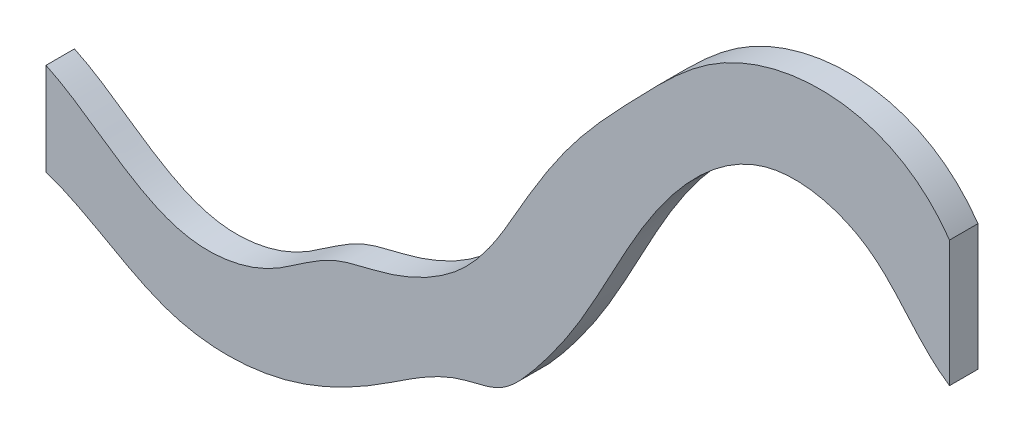
ISO-10303-21;
HEADER;
FILE_DESCRIPTION(('STEP AP214'),'2;1');
FILE_NAME('part.step','',(''),(''),'','','');
FILE_SCHEMA(('AUTOMOTIVE_DESIGN { 1 0 10303 214 1 1 1 1 }'));
ENDSEC;
DATA;
#1=APPLICATION_CONTEXT('core data for automotive mechanical design processes');
#2=APPLICATION_PROTOCOL_DEFINITION('international standard','automotive_design',2000,#1);
#3=PRODUCT_CONTEXT('',#1,'mechanical');
#4=PRODUCT('Part','Part','',(#3));
#5=PRODUCT_RELATED_PRODUCT_CATEGORY('part','',(#4));
#6=PRODUCT_DEFINITION_FORMATION('','',#4);
#7=PRODUCT_DEFINITION_CONTEXT('part definition',#1,'design');
#8=PRODUCT_DEFINITION('design','',#6,#7);
#9=PRODUCT_DEFINITION_SHAPE('','',#8);
#10=(LENGTH_UNIT() NAMED_UNIT(*) SI_UNIT(.MILLI.,.METRE.));
#11=(NAMED_UNIT(*) PLANE_ANGLE_UNIT() SI_UNIT($,.RADIAN.));
#12=(NAMED_UNIT(*) SI_UNIT($,.STERADIAN.) SOLID_ANGLE_UNIT());
#13=UNCERTAINTY_MEASURE_WITH_UNIT(LENGTH_MEASURE(1.E-05),#10,'distance_accuracy_value','');
#14=(GEOMETRIC_REPRESENTATION_CONTEXT(3) GLOBAL_UNCERTAINTY_ASSIGNED_CONTEXT((#13)) GLOBAL_UNIT_ASSIGNED_CONTEXT((#10,
#11,#12)) REPRESENTATION_CONTEXT('',''));
#15=CARTESIAN_POINT('',(0.,0.,0.));
#16=DIRECTION('',(0.,0.,1.));
#17=DIRECTION('',(1.,0.,0.));
#18=AXIS2_PLACEMENT_3D('',#15,#16,#17);
#19=CARTESIAN_POINT('',(0.,7.87401580810547,3.15));
#20=CARTESIAN_POINT('',(4.94459181573181,6.24385161729377,3.15));
#21=CARTESIAN_POINT('',(10.4757637319736,1.56019801215739,3.15));
#22=CARTESIAN_POINT('',(19.8009621386758,0.0784379150797091,3.15));
#23=CARTESIAN_POINT('',(28.0456395350766,1.02307095215012,3.15));
#24=CARTESIAN_POINT('',(36.9053783326223,5.62484186356792,3.15));
#25=CARTESIAN_POINT('',(44.0023246212655,10.9339511414631,3.15));
#26=CARTESIAN_POINT('',(50.422695685404,11.835006862494,3.15));
#27=CARTESIAN_POINT('',(54.5545828773429,16.3692020774855,3.15));
#28=CARTESIAN_POINT('',(59.4751541058392,23.228178272208,3.15));
#29=CARTESIAN_POINT('',(64.1435279081656,32.7150347750937,3.15));
#30=CARTESIAN_POINT('',(70.2596832149969,42.4494099727532,3.15));
#31=CARTESIAN_POINT('',(79.6498846475841,50.1463472340998,3.15));
#32=CARTESIAN_POINT('',(92.6825961644155,46.9488612720284,3.15));
#33=CARTESIAN_POINT('',(96.4460809441178,39.7132085351575,3.15));
#34=CARTESIAN_POINT('',(100.,37.4015731811523,3.15));
#35=B_SPLINE_CURVE_WITH_KNOTS('',3,(#19,#20,#21,#22,#23,#24,#25,#26,#27,#28,#29,#30,#31,#32,#33,
#34),.UNSPECIFIED.,.F.,.F.,(4,1,1,1,1,1,1,1,1,1,1,1,1,4),(0.,0.12488140068535,0.163041618050381,
0.222969139918411,0.319802795673937,0.398409542524113,0.43115817444735,0.468929657142561,
0.538576811722362,0.63546127527961,0.718983692688869,0.816425112264593,0.900124053639158,1.),.UNSPECIFIED.);
#36=DIRECTION('',(0.,0.,-1.));
#37=VECTOR('',#36,1.);
#38=SURFACE_OF_LINEAR_EXTRUSION('',#35,#37);
#39=CARTESIAN_POINT('',(0.,7.87401580810547,0.));
#40=CARTESIAN_POINT('',(4.94459181573181,6.24385161729377,0.));
#41=CARTESIAN_POINT('',(10.4757637319736,1.56019801215739,0.));
#42=CARTESIAN_POINT('',(19.8009621386758,0.0784379150797091,0.));
#43=CARTESIAN_POINT('',(28.0456395350766,1.02307095215012,0.));
#44=CARTESIAN_POINT('',(36.9053783326223,5.62484186356792,0.));
#45=CARTESIAN_POINT('',(44.0023246212655,10.9339511414631,0.));
#46=CARTESIAN_POINT('',(50.422695685404,11.835006862494,0.));
#47=CARTESIAN_POINT('',(54.5545828773429,16.3692020774855,0.));
#48=CARTESIAN_POINT('',(59.4751541058392,23.228178272208,0.));
#49=CARTESIAN_POINT('',(64.1435279081656,32.7150347750937,0.));
#50=CARTESIAN_POINT('',(70.2596832149969,42.4494099727532,0.));
#51=CARTESIAN_POINT('',(79.6498846475841,50.1463472340998,0.));
#52=CARTESIAN_POINT('',(92.6825961644155,46.9488612720284,0.));
#53=CARTESIAN_POINT('',(96.4460809441178,39.7132085351575,0.));
#54=CARTESIAN_POINT('',(100.,37.4015731811523,0.));
#55=B_SPLINE_CURVE_WITH_KNOTS('',3,(#39,#40,#41,#42,#43,#44,#45,#46,#47,#48,#49,#50,#51,#52,#53,
#54),.UNSPECIFIED.,.F.,.F.,(4,1,1,1,1,1,1,1,1,1,1,1,1,4),(0.,0.12488140068535,0.163041618050381,
0.222969139918411,0.319802795673937,0.398409542524113,0.43115817444735,0.468929657142561,
0.538576811722362,0.63546127527961,0.718983692688869,0.816425112264593,0.900124053639158,1.),.UNSPECIFIED.);
#56=CARTESIAN_POINT('',(0.,7.87401580810547,0.));
#57=VERTEX_POINT('',#56);
#58=CARTESIAN_POINT('',(100.,37.4015731811523,0.));
#59=VERTEX_POINT('',#58);
#60=EDGE_CURVE('E120',#57,#59,#55,.T.);
#61=ORIENTED_EDGE('',*,*,#60,.T.);
#62=DIRECTION('',(0.,0.,-1.));
#63=VECTOR('',#62,1.);
#64=CARTESIAN_POINT('',(100.,37.4015731811523,3.15));
#65=LINE('',#64,#63);
#66=CARTESIAN_POINT('',(100.,37.4015731811523,3.15));
#67=VERTEX_POINT('',#66);
#68=EDGE_CURVE('E11',#67,#59,#65,.T.);
#69=ORIENTED_EDGE('',*,*,#68,.F.);
#70=CARTESIAN_POINT('',(0.,7.87401580810547,3.15));
#71=VERTEX_POINT('',#70);
#72=EDGE_CURVE('E89',#71,#67,#35,.T.);
#73=ORIENTED_EDGE('',*,*,#72,.F.);
#74=DIRECTION('',(0.,0.,-1.));
#75=VECTOR('',#74,1.);
#76=CARTESIAN_POINT('',(0.,7.87401580810547,3.15));
#77=LINE('',#76,#75);
#78=EDGE_CURVE('E97',#71,#57,#77,.T.);
#79=ORIENTED_EDGE('',*,*,#78,.T.);
#80=EDGE_LOOP('',(#61,#69,#73,#79));
#81=FACE_BOUND('',#80,.T.);
#82=ADVANCED_FACE('F37',(#81),#38,.F.);
#83=CARTESIAN_POINT('',(100.,51.3600583369435,3.15));
#84=DIRECTION('',(-1.,0.,0.));
#85=DIRECTION('',(0.,0.,1.));
#86=AXIS2_PLACEMENT_3D('',#83,#84,#85);
#87=PLANE('',#86);
#88=DIRECTION('',(0.,1.,0.));
#89=VECTOR('',#88,1.);
#90=CARTESIAN_POINT('',(100.,51.3600583369435,0.));
#91=LINE('',#90,#89);
#92=CARTESIAN_POINT('',(100.,51.3600583369435,0.));
#93=VERTEX_POINT('',#92);
#94=EDGE_CURVE('E93',#59,#93,#91,.T.);
#95=ORIENTED_EDGE('',*,*,#94,.T.);
#96=DIRECTION('',(0.,0.,-1.));
#97=VECTOR('',#96,1.);
#98=CARTESIAN_POINT('',(100.,51.3600583369435,3.15));
#99=LINE('',#98,#97);
#100=CARTESIAN_POINT('',(100.,51.3600583369435,3.15));
#101=VERTEX_POINT('',#100);
#102=EDGE_CURVE('E46',#101,#93,#99,.T.);
#103=ORIENTED_EDGE('',*,*,#102,.F.);
#104=DIRECTION('',(0.,1.,0.));
#105=VECTOR('',#104,1.);
#106=CARTESIAN_POINT('',(100.,51.3600583369435,3.15));
#107=LINE('',#106,#105);
#108=EDGE_CURVE('E84',#67,#101,#107,.T.);
#109=ORIENTED_EDGE('',*,*,#108,.F.);
#110=ORIENTED_EDGE('',*,*,#68,.T.);
#111=EDGE_LOOP('',(#95,#103,#109,#110));
#112=FACE_BOUND('',#111,.T.);
#113=ADVANCED_FACE('F92',(#112),#87,.F.);
#114=CARTESIAN_POINT('',(100.,51.3600583369435,3.15));
#115=CARTESIAN_POINT('',(93.8349129380906,60.2242677289957,3.15));
#116=CARTESIAN_POINT('',(77.6815120510828,60.2701789897992,3.15));
#117=CARTESIAN_POINT('',(65.9179666509676,48.2337775957625,3.15));
#118=CARTESIAN_POINT('',(58.5356318651787,40.5274012157212,3.15));
#119=CARTESIAN_POINT('',(52.5950751328618,31.3019544354315,3.15));
#120=CARTESIAN_POINT('',(47.5300186377978,21.4371686036796,3.15));
#121=CARTESIAN_POINT('',(38.8395840063064,16.9233970142315,3.15));
#122=CARTESIAN_POINT('',(30.8311177347705,15.6467867727138,3.15));
#123=CARTESIAN_POINT('',(25.0978769617379,10.2326300475898,3.15));
#124=CARTESIAN_POINT('',(12.5012165025488,7.74485526128673,3.15));
#125=CARTESIAN_POINT('',(5.19725083705631,15.6810706218243,3.15));
#126=CARTESIAN_POINT('',(0.,18.110237121582,3.15));
#127=B_SPLINE_CURVE_WITH_KNOTS('',3,(#114,#115,#116,#117,#118,#119,#120,#121,#122,#123,#124,
#125,#126),.UNSPECIFIED.,.F.,.F.,(4,1,1,1,1,1,1,1,1,1,4),(0.,0.225398540435107,
0.318231423295847,0.404161036345138,0.484762606498662,0.585751485566438,0.665781609173071,
0.712280382254172,0.77964836561405,0.851058294438362,1.),.UNSPECIFIED.);
#128=DIRECTION('',(0.,0.,-1.));
#129=VECTOR('',#128,1.);
#130=SURFACE_OF_LINEAR_EXTRUSION('',#127,#129);
#131=CARTESIAN_POINT('',(100.,51.3600583369435,0.));
#132=CARTESIAN_POINT('',(93.8349129380906,60.2242677289957,0.));
#133=CARTESIAN_POINT('',(77.6815120510828,60.2701789897992,0.));
#134=CARTESIAN_POINT('',(65.9179666509676,48.2337775957625,0.));
#135=CARTESIAN_POINT('',(58.5356318651787,40.5274012157212,0.));
#136=CARTESIAN_POINT('',(52.5950751328618,31.3019544354315,0.));
#137=CARTESIAN_POINT('',(47.5300186377978,21.4371686036796,0.));
#138=CARTESIAN_POINT('',(38.8395840063064,16.9233970142315,0.));
#139=CARTESIAN_POINT('',(30.8311177347705,15.6467867727138,0.));
#140=CARTESIAN_POINT('',(25.0978769617379,10.2326300475898,0.));
#141=CARTESIAN_POINT('',(12.5012165025488,7.74485526128673,0.));
#142=CARTESIAN_POINT('',(5.19725083705631,15.6810706218243,0.));
#143=CARTESIAN_POINT('',(0.,18.110237121582,0.));
#144=B_SPLINE_CURVE_WITH_KNOTS('',3,(#131,#132,#133,#134,#135,#136,#137,#138,#139,#140,#141,
#142,#143),.UNSPECIFIED.,.F.,.F.,(4,1,1,1,1,1,1,1,1,1,4),(0.,0.225398540435107,
0.318231423295847,0.404161036345138,0.484762606498662,0.585751485566438,0.665781609173071,
0.712280382254172,0.77964836561405,0.851058294438362,1.),.UNSPECIFIED.);
#145=CARTESIAN_POINT('',(0.,18.110237121582,0.));
#146=VERTEX_POINT('',#145);
#147=EDGE_CURVE('E71',#93,#146,#144,.T.);
#148=ORIENTED_EDGE('',*,*,#147,.T.);
#149=DIRECTION('',(0.,0.,-1.));
#150=VECTOR('',#149,1.);
#151=CARTESIAN_POINT('',(0.,18.110237121582,3.15));
#152=LINE('',#151,#150);
#153=CARTESIAN_POINT('',(0.,18.110237121582,3.15));
#154=VERTEX_POINT('',#153);
#155=EDGE_CURVE('E94',#154,#146,#152,.T.);
#156=ORIENTED_EDGE('',*,*,#155,.F.);
#157=EDGE_CURVE('E87',#101,#154,#127,.T.);
#158=ORIENTED_EDGE('',*,*,#157,.F.);
#159=ORIENTED_EDGE('',*,*,#102,.T.);
#160=EDGE_LOOP('',(#148,#156,#158,#159));
#161=FACE_BOUND('',#160,.T.);
#162=ADVANCED_FACE('F95',(#161),#130,.F.);
#163=CARTESIAN_POINT('',(0.,7.87401580810547,3.15));
#164=DIRECTION('',(1.,0.,0.));
#165=DIRECTION('',(0.,0.,-1.));
#166=AXIS2_PLACEMENT_3D('',#163,#164,#165);
#167=PLANE('',#166);
#168=DIRECTION('',(0.,-1.,0.));
#169=VECTOR('',#168,1.);
#170=CARTESIAN_POINT('',(0.,7.87401580810547,0.));
#171=LINE('',#170,#169);
#172=EDGE_CURVE('E77',#146,#57,#171,.T.);
#173=ORIENTED_EDGE('',*,*,#172,.T.);
#174=ORIENTED_EDGE('',*,*,#78,.F.);
#175=DIRECTION('',(0.,-1.,0.));
#176=VECTOR('',#175,1.);
#177=CARTESIAN_POINT('',(0.,7.87401580810547,3.15));
#178=LINE('',#177,#176);
#179=EDGE_CURVE('E54',#154,#71,#178,.T.);
#180=ORIENTED_EDGE('',*,*,#179,.F.);
#181=ORIENTED_EDGE('',*,*,#155,.T.);
#182=EDGE_LOOP('',(#173,#174,#180,#181));
#183=FACE_BOUND('',#182,.T.);
#184=ADVANCED_FACE('F109',(#183),#167,.F.);
#185=CARTESIAN_POINT('',(55.9764322142341,18.4490720323016,3.15));
#186=DIRECTION('',(0.,0.,1.));
#187=DIRECTION('',(1.,0.,0.));
#188=AXIS2_PLACEMENT_3D('',#185,#186,#187);
#189=PLANE('',#188);
#190=ORIENTED_EDGE('',*,*,#72,.T.);
#191=ORIENTED_EDGE('',*,*,#108,.T.);
#192=ORIENTED_EDGE('',*,*,#157,.T.);
#193=ORIENTED_EDGE('',*,*,#179,.T.);
#194=EDGE_LOOP('',(#190,#191,#192,#193));
#195=FACE_BOUND('',#194,.T.);
#196=ADVANCED_FACE('F85',(#195),#189,.T.);
#197=CARTESIAN_POINT('',(55.9764322142341,18.4490720323016,0.));
#198=DIRECTION('',(0.,0.,1.));
#199=DIRECTION('',(1.,0.,0.));
#200=AXIS2_PLACEMENT_3D('',#197,#198,#199);
#201=PLANE('',#200);
#202=ORIENTED_EDGE('',*,*,#60,.F.);
#203=ORIENTED_EDGE('',*,*,#172,.F.);
#204=ORIENTED_EDGE('',*,*,#147,.F.);
#205=ORIENTED_EDGE('',*,*,#94,.F.);
#206=EDGE_LOOP('',(#202,#203,#204,#205));
#207=FACE_BOUND('',#206,.T.);
#208=ADVANCED_FACE('F137',(#207),#201,.F.);
#209=CLOSED_SHELL('',(#82,#113,#162,#184,#196,#208));
#210=MANIFOLD_SOLID_BREP('B2',#209);
#211=ADVANCED_BREP_SHAPE_REPRESENTATION('',(#18,#210),#14);
#212=SHAPE_DEFINITION_REPRESENTATION(#9,#211);
ENDSEC;
END-ISO-10303-21;
